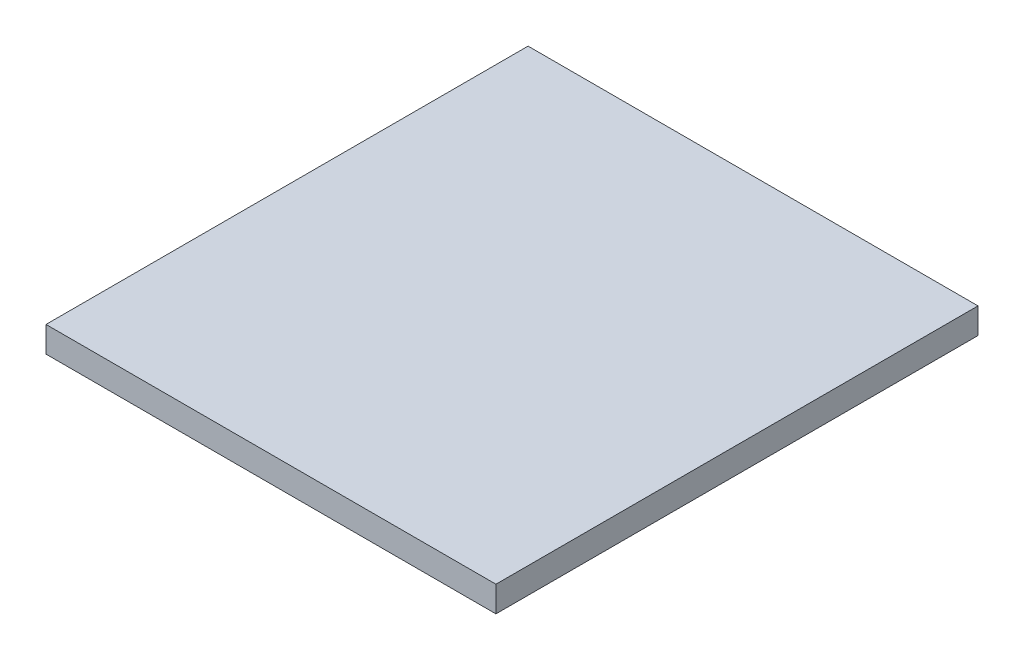
ISO-10303-21;
HEADER;
FILE_DESCRIPTION(('STEP AP214'),'2;1');
FILE_NAME('part.step','',(''),(''),'','','');
FILE_SCHEMA(('AUTOMOTIVE_DESIGN { 1 0 10303 214 1 1 1 1 }'));
ENDSEC;
DATA;
#1=APPLICATION_CONTEXT('core data for automotive mechanical design processes');
#2=APPLICATION_PROTOCOL_DEFINITION('international standard','automotive_design',2000,#1);
#3=PRODUCT_CONTEXT('',#1,'mechanical');
#4=PRODUCT('Part','Part','',(#3));
#5=PRODUCT_RELATED_PRODUCT_CATEGORY('part','',(#4));
#6=PRODUCT_DEFINITION_FORMATION('','',#4);
#7=PRODUCT_DEFINITION_CONTEXT('part definition',#1,'design');
#8=PRODUCT_DEFINITION('design','',#6,#7);
#9=PRODUCT_DEFINITION_SHAPE('','',#8);
#10=(LENGTH_UNIT() NAMED_UNIT(*) SI_UNIT(.MILLI.,.METRE.));
#11=(NAMED_UNIT(*) PLANE_ANGLE_UNIT() SI_UNIT($,.RADIAN.));
#12=(NAMED_UNIT(*) SI_UNIT($,.STERADIAN.) SOLID_ANGLE_UNIT());
#13=UNCERTAINTY_MEASURE_WITH_UNIT(LENGTH_MEASURE(1.E-05),#10,'distance_accuracy_value','');
#14=(GEOMETRIC_REPRESENTATION_CONTEXT(3) GLOBAL_UNCERTAINTY_ASSIGNED_CONTEXT((#13)) GLOBAL_UNIT_ASSIGNED_CONTEXT((#10,
#11,#12)) REPRESENTATION_CONTEXT('',''));
#15=CARTESIAN_POINT('',(0.,0.,0.));
#16=DIRECTION('',(0.,0.,1.));
#17=DIRECTION('',(1.,0.,0.));
#18=AXIS2_PLACEMENT_3D('',#15,#16,#17);
#19=CARTESIAN_POINT('',(17.5,2.,18.75));
#20=DIRECTION('',(-1.,0.,0.));
#21=DIRECTION('',(0.,0.,1.));
#22=AXIS2_PLACEMENT_3D('',#19,#20,#21);
#23=PLANE('',#22);
#24=DIRECTION('',(0.,0.,-1.));
#25=VECTOR('',#24,1.);
#26=CARTESIAN_POINT('',(17.5,0.,18.75));
#27=LINE('',#26,#25);
#28=CARTESIAN_POINT('',(17.5,0.,18.75));
#29=VERTEX_POINT('',#28);
#30=CARTESIAN_POINT('',(17.5,0.,-18.75));
#31=VERTEX_POINT('',#30);
#32=EDGE_CURVE('E96',#29,#31,#27,.T.);
#33=ORIENTED_EDGE('',*,*,#32,.T.);
#34=DIRECTION('',(0.,-1.,0.));
#35=VECTOR('',#34,1.);
#36=CARTESIAN_POINT('',(17.5,2.,-18.75));
#37=LINE('',#36,#35);
#38=CARTESIAN_POINT('',(17.5,2.,-18.75));
#39=VERTEX_POINT('',#38);
#40=EDGE_CURVE('E11',#39,#31,#37,.T.);
#41=ORIENTED_EDGE('',*,*,#40,.F.);
#42=DIRECTION('',(0.,0.,-1.));
#43=VECTOR('',#42,1.);
#44=CARTESIAN_POINT('',(17.5,2.,18.75));
#45=LINE('',#44,#43);
#46=CARTESIAN_POINT('',(17.5,2.,18.75));
#47=VERTEX_POINT('',#46);
#48=EDGE_CURVE('E84',#47,#39,#45,.T.);
#49=ORIENTED_EDGE('',*,*,#48,.F.);
#50=DIRECTION('',(0.,-1.,0.));
#51=VECTOR('',#50,1.);
#52=CARTESIAN_POINT('',(17.5,2.,18.75));
#53=LINE('',#52,#51);
#54=EDGE_CURVE('E92',#47,#29,#53,.T.);
#55=ORIENTED_EDGE('',*,*,#54,.T.);
#56=EDGE_LOOP('',(#33,#41,#49,#55));
#57=FACE_BOUND('',#56,.T.);
#58=ADVANCED_FACE('F33',(#57),#23,.F.);
#59=CARTESIAN_POINT('',(-17.5,2.,-18.75));
#60=DIRECTION('',(0.,0.,1.));
#61=DIRECTION('',(1.,0.,0.));
#62=AXIS2_PLACEMENT_3D('',#59,#60,#61);
#63=PLANE('',#62);
#64=DIRECTION('',(-1.,0.,0.));
#65=VECTOR('',#64,1.);
#66=CARTESIAN_POINT('',(-17.5,0.,-18.75));
#67=LINE('',#66,#65);
#68=CARTESIAN_POINT('',(-17.5,0.,-18.75));
#69=VERTEX_POINT('',#68);
#70=EDGE_CURVE('E88',#31,#69,#67,.T.);
#71=ORIENTED_EDGE('',*,*,#70,.T.);
#72=DIRECTION('',(0.,-1.,0.));
#73=VECTOR('',#72,1.);
#74=CARTESIAN_POINT('',(-17.5,2.,-18.75));
#75=LINE('',#74,#73);
#76=CARTESIAN_POINT('',(-17.5,2.,-18.75));
#77=VERTEX_POINT('',#76);
#78=EDGE_CURVE('E41',#77,#69,#75,.T.);
#79=ORIENTED_EDGE('',*,*,#78,.F.);
#80=DIRECTION('',(-1.,0.,0.));
#81=VECTOR('',#80,1.);
#82=CARTESIAN_POINT('',(-17.5,2.,-18.75));
#83=LINE('',#82,#81);
#84=EDGE_CURVE('E79',#39,#77,#83,.T.);
#85=ORIENTED_EDGE('',*,*,#84,.F.);
#86=ORIENTED_EDGE('',*,*,#40,.T.);
#87=EDGE_LOOP('',(#71,#79,#85,#86));
#88=FACE_BOUND('',#87,.T.);
#89=ADVANCED_FACE('F87',(#88),#63,.F.);
#90=CARTESIAN_POINT('',(-17.5,2.,18.75));
#91=DIRECTION('',(1.,0.,0.));
#92=DIRECTION('',(0.,0.,-1.));
#93=AXIS2_PLACEMENT_3D('',#90,#91,#92);
#94=PLANE('',#93);
#95=DIRECTION('',(0.,0.,1.));
#96=VECTOR('',#95,1.);
#97=CARTESIAN_POINT('',(-17.5,0.,18.75));
#98=LINE('',#97,#96);
#99=CARTESIAN_POINT('',(-17.5,0.,18.75));
#100=VERTEX_POINT('',#99);
#101=EDGE_CURVE('E66',#69,#100,#98,.T.);
#102=ORIENTED_EDGE('',*,*,#101,.T.);
#103=DIRECTION('',(0.,-1.,0.));
#104=VECTOR('',#103,1.);
#105=CARTESIAN_POINT('',(-17.5,2.,18.75));
#106=LINE('',#105,#104);
#107=CARTESIAN_POINT('',(-17.5,2.,18.75));
#108=VERTEX_POINT('',#107);
#109=EDGE_CURVE('E89',#108,#100,#106,.T.);
#110=ORIENTED_EDGE('',*,*,#109,.F.);
#111=DIRECTION('',(0.,0.,1.));
#112=VECTOR('',#111,1.);
#113=CARTESIAN_POINT('',(-17.5,2.,18.75));
#114=LINE('',#113,#112);
#115=EDGE_CURVE('E82',#77,#108,#114,.T.);
#116=ORIENTED_EDGE('',*,*,#115,.F.);
#117=ORIENTED_EDGE('',*,*,#78,.T.);
#118=EDGE_LOOP('',(#102,#110,#116,#117));
#119=FACE_BOUND('',#118,.T.);
#120=ADVANCED_FACE('F90',(#119),#94,.F.);
#121=CARTESIAN_POINT('',(-17.5,2.,18.75));
#122=DIRECTION('',(0.,0.,-1.));
#123=DIRECTION('',(-1.,0.,0.));
#124=AXIS2_PLACEMENT_3D('',#121,#122,#123);
#125=PLANE('',#124);
#126=DIRECTION('',(1.,0.,0.));
#127=VECTOR('',#126,1.);
#128=CARTESIAN_POINT('',(-17.5,0.,18.75));
#129=LINE('',#128,#127);
#130=EDGE_CURVE('E72',#100,#29,#129,.T.);
#131=ORIENTED_EDGE('',*,*,#130,.T.);
#132=ORIENTED_EDGE('',*,*,#54,.F.);
#133=DIRECTION('',(1.,0.,0.));
#134=VECTOR('',#133,1.);
#135=CARTESIAN_POINT('',(-17.5,2.,18.75));
#136=LINE('',#135,#134);
#137=EDGE_CURVE('E49',#108,#47,#136,.T.);
#138=ORIENTED_EDGE('',*,*,#137,.F.);
#139=ORIENTED_EDGE('',*,*,#109,.T.);
#140=EDGE_LOOP('',(#131,#132,#138,#139));
#141=FACE_BOUND('',#140,.T.);
#142=ADVANCED_FACE('F103',(#141),#125,.F.);
#143=CARTESIAN_POINT('',(0.,2.,0.));
#144=DIRECTION('',(0.,-1.,0.));
#145=DIRECTION('',(0.,0.,-1.));
#146=AXIS2_PLACEMENT_3D('',#143,#144,#145);
#147=PLANE('',#146);
#148=ORIENTED_EDGE('',*,*,#48,.T.);
#149=ORIENTED_EDGE('',*,*,#84,.T.);
#150=ORIENTED_EDGE('',*,*,#115,.T.);
#151=ORIENTED_EDGE('',*,*,#137,.T.);
#152=EDGE_LOOP('',(#148,#149,#150,#151));
#153=FACE_BOUND('',#152,.T.);
#154=ADVANCED_FACE('F80',(#153),#147,.F.);
#155=CARTESIAN_POINT('',(0.,0.,0.));
#156=DIRECTION('',(0.,-1.,0.));
#157=DIRECTION('',(0.,0.,-1.));
#158=AXIS2_PLACEMENT_3D('',#155,#156,#157);
#159=PLANE('',#158);
#160=ORIENTED_EDGE('',*,*,#32,.F.);
#161=ORIENTED_EDGE('',*,*,#130,.F.);
#162=ORIENTED_EDGE('',*,*,#101,.F.);
#163=ORIENTED_EDGE('',*,*,#70,.F.);
#164=EDGE_LOOP('',(#160,#161,#162,#163));
#165=FACE_BOUND('',#164,.T.);
#166=ADVANCED_FACE('F106',(#165),#159,.T.);
#167=CLOSED_SHELL('',(#58,#89,#120,#142,#154,#166));
#168=MANIFOLD_SOLID_BREP('B2',#167);
#169=ADVANCED_BREP_SHAPE_REPRESENTATION('',(#18,#168),#14);
#170=SHAPE_DEFINITION_REPRESENTATION(#9,#169);
ENDSEC;
END-ISO-10303-21;
